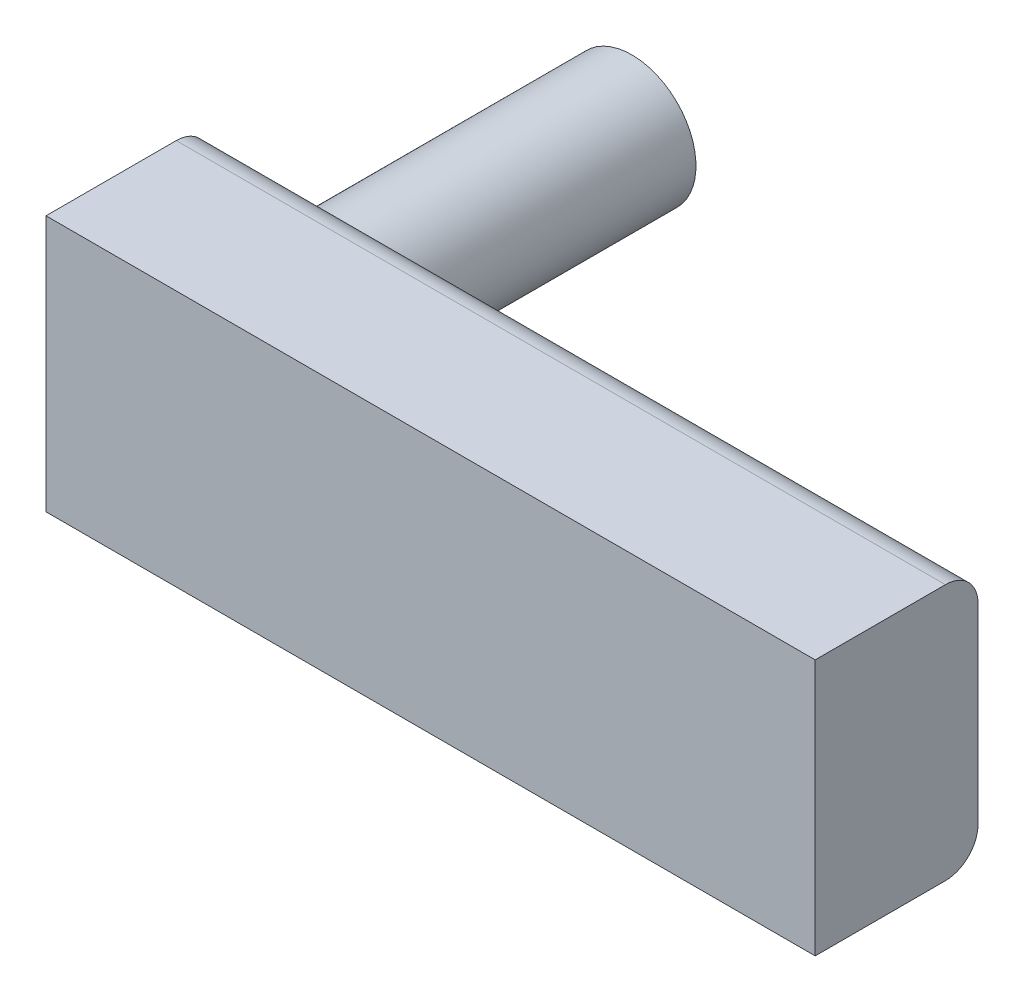
ISO-10303-21;
HEADER;
FILE_DESCRIPTION(('STEP AP214'),'2;1');
FILE_NAME('part.step','',(''),(''),'','','');
FILE_SCHEMA(('AUTOMOTIVE_DESIGN { 1 0 10303 214 1 1 1 1 }'));
ENDSEC;
DATA;
#1=APPLICATION_CONTEXT('core data for automotive mechanical design processes');
#2=APPLICATION_PROTOCOL_DEFINITION('international standard','automotive_design',2000,#1);
#3=PRODUCT_CONTEXT('',#1,'mechanical');
#4=PRODUCT('Part','Part','',(#3));
#5=PRODUCT_RELATED_PRODUCT_CATEGORY('part','',(#4));
#6=PRODUCT_DEFINITION_FORMATION('','',#4);
#7=PRODUCT_DEFINITION_CONTEXT('part definition',#1,'design');
#8=PRODUCT_DEFINITION('design','',#6,#7);
#9=PRODUCT_DEFINITION_SHAPE('','',#8);
#10=(LENGTH_UNIT() NAMED_UNIT(*) SI_UNIT(.MILLI.,.METRE.));
#11=(NAMED_UNIT(*) PLANE_ANGLE_UNIT() SI_UNIT($,.RADIAN.));
#12=(NAMED_UNIT(*) SI_UNIT($,.STERADIAN.) SOLID_ANGLE_UNIT());
#13=UNCERTAINTY_MEASURE_WITH_UNIT(LENGTH_MEASURE(1.E-05),#10,'distance_accuracy_value','');
#14=(GEOMETRIC_REPRESENTATION_CONTEXT(3) GLOBAL_UNCERTAINTY_ASSIGNED_CONTEXT((#13)) GLOBAL_UNIT_ASSIGNED_CONTEXT((#10,
#11,#12)) REPRESENTATION_CONTEXT('',''));
#15=CARTESIAN_POINT('',(0.,0.,0.));
#16=DIRECTION('',(0.,0.,1.));
#17=DIRECTION('',(1.,0.,0.));
#18=AXIS2_PLACEMENT_3D('',#15,#16,#17);
#19=CARTESIAN_POINT('',(-82.4987312572087,-35.4905256220135,12.7));
#20=DIRECTION('',(1.,0.,0.));
#21=DIRECTION('',(0.,0.,-1.));
#22=AXIS2_PLACEMENT_3D('',#19,#20,#21);
#23=PLANE('',#22);
#24=DIRECTION('',(0.,0.,-1.));
#25=VECTOR('',#24,1.);
#26=CARTESIAN_POINT('',(-82.4987312572087,-15.4905256220135,12.7));
#27=LINE('',#26,#25);
#28=CARTESIAN_POINT('',(-82.4987312572087,-15.4905256220135,12.7));
#29=VERTEX_POINT('',#28);
#30=CARTESIAN_POINT('',(-82.4987312572087,-15.4905256220135,2.54));
#31=VERTEX_POINT('',#30);
#32=EDGE_CURVE('E128',#29,#31,#27,.T.);
#33=ORIENTED_EDGE('',*,*,#32,.T.);
#34=CARTESIAN_POINT('',(-82.4987312572087,-18.0305256220135,2.54));
#35=DIRECTION('',(1.,0.,0.));
#36=DIRECTION('',(0.,0.,-1.));
#37=AXIS2_PLACEMENT_3D('',#34,#35,#36);
#38=CIRCLE('',#37,2.54);
#39=CARTESIAN_POINT('',(-82.4987312572087,-18.0305256220135,0.));
#40=VERTEX_POINT('',#39);
#41=EDGE_CURVE('E55',#31,#40,#38,.F.);
#42=ORIENTED_EDGE('',*,*,#41,.T.);
#43=DIRECTION('',(0.,-1.,0.));
#44=VECTOR('',#43,1.);
#45=CARTESIAN_POINT('',(-82.4987312572087,-35.4905256220135,0.));
#46=LINE('',#45,#44);
#47=CARTESIAN_POINT('',(-82.4987312572087,-32.9505256220135,0.));
#48=VERTEX_POINT('',#47);
#49=EDGE_CURVE('E136',#40,#48,#46,.T.);
#50=ORIENTED_EDGE('',*,*,#49,.T.);
#51=CARTESIAN_POINT('',(-82.4987312572087,-32.9505256220135,2.54));
#52=DIRECTION('',(1.,0.,0.));
#53=DIRECTION('',(0.,0.,-1.));
#54=AXIS2_PLACEMENT_3D('',#51,#52,#53);
#55=CIRCLE('',#54,2.54);
#56=CARTESIAN_POINT('',(-82.4987312572087,-35.4905256220135,2.54));
#57=VERTEX_POINT('',#56);
#58=EDGE_CURVE('E107',#48,#57,#55,.F.);
#59=ORIENTED_EDGE('',*,*,#58,.T.);
#60=DIRECTION('',(0.,0.,-1.));
#61=VECTOR('',#60,1.);
#62=CARTESIAN_POINT('',(-82.4987312572087,-35.4905256220135,12.7));
#63=LINE('',#62,#61);
#64=CARTESIAN_POINT('',(-82.4987312572087,-35.4905256220135,12.7));
#65=VERTEX_POINT('',#64);
#66=EDGE_CURVE('E90',#65,#57,#63,.T.);
#67=ORIENTED_EDGE('',*,*,#66,.F.);
#68=DIRECTION('',(0.,-1.,0.));
#69=VECTOR('',#68,1.);
#70=CARTESIAN_POINT('',(-82.4987312572087,-35.4905256220135,12.7));
#71=LINE('',#70,#69);
#72=EDGE_CURVE('E97',#29,#65,#71,.T.);
#73=ORIENTED_EDGE('',*,*,#72,.F.);
#74=EDGE_LOOP('',(#33,#42,#50,#59,#67,#73));
#75=FACE_BOUND('',#74,.T.);
#76=ADVANCED_FACE('F33',(#75),#23,.F.);
#77=CARTESIAN_POINT('',(-22.4987312572088,-35.4905256220135,12.7));
#78=DIRECTION('',(0.,1.,0.));
#79=DIRECTION('',(0.,0.,1.));
#80=AXIS2_PLACEMENT_3D('',#77,#78,#79);
#81=PLANE('',#80);
#82=ORIENTED_EDGE('',*,*,#66,.T.);
#83=DIRECTION('',(1.,0.,0.));
#84=VECTOR('',#83,1.);
#85=CARTESIAN_POINT('',(-22.4987312572088,-35.4905256220135,2.54));
#86=LINE('',#85,#84);
#87=CARTESIAN_POINT('',(-22.4987312572088,-35.4905256220135,2.54));
#88=VERTEX_POINT('',#87);
#89=EDGE_CURVE('E108',#57,#88,#86,.T.);
#90=ORIENTED_EDGE('',*,*,#89,.T.);
#91=DIRECTION('',(0.,0.,-1.));
#92=VECTOR('',#91,1.);
#93=CARTESIAN_POINT('',(-22.4987312572088,-35.4905256220135,12.7));
#94=LINE('',#93,#92);
#95=CARTESIAN_POINT('',(-22.4987312572088,-35.4905256220135,12.7));
#96=VERTEX_POINT('',#95);
#97=EDGE_CURVE('E93',#96,#88,#94,.T.);
#98=ORIENTED_EDGE('',*,*,#97,.F.);
#99=DIRECTION('',(1.,0.,0.));
#100=VECTOR('',#99,1.);
#101=CARTESIAN_POINT('',(-22.4987312572088,-35.4905256220135,12.7));
#102=LINE('',#101,#100);
#103=EDGE_CURVE('E85',#65,#96,#102,.T.);
#104=ORIENTED_EDGE('',*,*,#103,.F.);
#105=EDGE_LOOP('',(#82,#90,#98,#104));
#106=FACE_BOUND('',#105,.T.);
#107=ADVANCED_FACE('F87',(#106),#81,.F.);
#108=CARTESIAN_POINT('',(-22.4987312572088,-15.4905256220135,12.7));
#109=DIRECTION('',(-1.,0.,0.));
#110=DIRECTION('',(0.,0.,1.));
#111=AXIS2_PLACEMENT_3D('',#108,#109,#110);
#112=PLANE('',#111);
#113=DIRECTION('',(0.,1.,0.));
#114=VECTOR('',#113,1.);
#115=CARTESIAN_POINT('',(-22.4987312572088,-15.4905256220135,0.));
#116=LINE('',#115,#114);
#117=CARTESIAN_POINT('',(-22.4987312572088,-32.9505256220135,0.));
#118=VERTEX_POINT('',#117);
#119=CARTESIAN_POINT('',(-22.4987312572088,-18.0305256220135,0.));
#120=VERTEX_POINT('',#119);
#121=EDGE_CURVE('E104',#118,#120,#116,.T.);
#122=ORIENTED_EDGE('',*,*,#121,.T.);
#123=CARTESIAN_POINT('',(-22.4987312572087,-18.0305256220135,2.54));
#124=DIRECTION('',(-1.,0.,0.));
#125=DIRECTION('',(0.,0.,1.));
#126=AXIS2_PLACEMENT_3D('',#123,#124,#125);
#127=CIRCLE('',#126,2.54);
#128=CARTESIAN_POINT('',(-22.4987312572088,-15.4905256220135,2.54));
#129=VERTEX_POINT('',#128);
#130=EDGE_CURVE('E11',#120,#129,#127,.F.);
#131=ORIENTED_EDGE('',*,*,#130,.T.);
#132=DIRECTION('',(0.,0.,-1.));
#133=VECTOR('',#132,1.);
#134=CARTESIAN_POINT('',(-22.4987312572088,-15.4905256220135,12.7));
#135=LINE('',#134,#133);
#136=CARTESIAN_POINT('',(-22.4987312572088,-15.4905256220135,12.7));
#137=VERTEX_POINT('',#136);
#138=EDGE_CURVE('E112',#137,#129,#135,.T.);
#139=ORIENTED_EDGE('',*,*,#138,.F.);
#140=DIRECTION('',(0.,1.,0.));
#141=VECTOR('',#140,1.);
#142=CARTESIAN_POINT('',(-22.4987312572088,-15.4905256220135,12.7));
#143=LINE('',#142,#141);
#144=EDGE_CURVE('E96',#96,#137,#143,.T.);
#145=ORIENTED_EDGE('',*,*,#144,.F.);
#146=ORIENTED_EDGE('',*,*,#97,.T.);
#147=CARTESIAN_POINT('',(-22.4987312572088,-32.9505256220135,2.54));
#148=DIRECTION('',(-1.,0.,0.));
#149=DIRECTION('',(0.,0.,1.));
#150=AXIS2_PLACEMENT_3D('',#147,#148,#149);
#151=CIRCLE('',#150,2.54);
#152=EDGE_CURVE('E110',#88,#118,#151,.F.);
#153=ORIENTED_EDGE('',*,*,#152,.T.);
#154=EDGE_LOOP('',(#122,#131,#139,#145,#146,#153));
#155=FACE_BOUND('',#154,.T.);
#156=ADVANCED_FACE('F160',(#155),#112,.F.);
#157=CARTESIAN_POINT('',(-82.4987312572087,-15.4905256220135,12.7));
#158=DIRECTION('',(0.,-1.,0.));
#159=DIRECTION('',(0.,0.,-1.));
#160=AXIS2_PLACEMENT_3D('',#157,#158,#159);
#161=PLANE('',#160);
#162=ORIENTED_EDGE('',*,*,#138,.T.);
#163=DIRECTION('',(-1.,0.,0.));
#164=VECTOR('',#163,1.);
#165=CARTESIAN_POINT('',(-82.4987312572087,-15.4905256220135,2.54));
#166=LINE('',#165,#164);
#167=EDGE_CURVE('E121',#129,#31,#166,.T.);
#168=ORIENTED_EDGE('',*,*,#167,.T.);
#169=ORIENTED_EDGE('',*,*,#32,.F.);
#170=DIRECTION('',(-1.,0.,0.));
#171=VECTOR('',#170,1.);
#172=CARTESIAN_POINT('',(-82.4987312572087,-15.4905256220135,12.7));
#173=LINE('',#172,#171);
#174=EDGE_CURVE('E102',#137,#29,#173,.T.);
#175=ORIENTED_EDGE('',*,*,#174,.F.);
#176=EDGE_LOOP('',(#162,#168,#169,#175));
#177=FACE_BOUND('',#176,.T.);
#178=ADVANCED_FACE('F127',(#177),#161,.F.);
#179=CARTESIAN_POINT('',(0.,0.,12.7));
#180=DIRECTION('',(0.,0.,-1.));
#181=DIRECTION('',(-1.,0.,0.));
#182=AXIS2_PLACEMENT_3D('',#179,#180,#181);
#183=PLANE('',#182);
#184=ORIENTED_EDGE('',*,*,#72,.T.);
#185=ORIENTED_EDGE('',*,*,#103,.T.);
#186=ORIENTED_EDGE('',*,*,#144,.T.);
#187=ORIENTED_EDGE('',*,*,#174,.T.);
#188=EDGE_LOOP('',(#184,#185,#186,#187));
#189=FACE_BOUND('',#188,.T.);
#190=ADVANCED_FACE('F100',(#189),#183,.F.);
#191=CARTESIAN_POINT('',(0.,0.,0.));
#192=DIRECTION('',(0.,0.,-1.));
#193=DIRECTION('',(-1.,0.,0.));
#194=AXIS2_PLACEMENT_3D('',#191,#192,#193);
#195=PLANE('',#194);
#196=CARTESIAN_POINT('',(-74.8990191403741,-24.8666440278333,0.));
#197=DIRECTION('',(0.,0.,-1.));
#198=DIRECTION('',(-1.,0.,0.));
#199=AXIS2_PLACEMENT_3D('',#196,#197,#198);
#200=CIRCLE('',#199,5.);
#201=CARTESIAN_POINT('',(-79.8990191403742,-24.8666440278333,0.));
#202=VERTEX_POINT('',#201);
#203=EDGE_CURVE('E140',#202,#202,#200,.T.);
#204=ORIENTED_EDGE('',*,*,#203,.F.);
#205=EDGE_LOOP('',(#204));
#206=FACE_BOUND('',#205,.T.);
#207=ORIENTED_EDGE('',*,*,#49,.F.);
#208=DIRECTION('',(-1.,0.,0.));
#209=VECTOR('',#208,1.);
#210=CARTESIAN_POINT('',(-22.4987312572087,-18.0305256220135,0.));
#211=LINE('',#210,#209);
#212=EDGE_CURVE('E41',#40,#120,#211,.F.);
#213=ORIENTED_EDGE('',*,*,#212,.T.);
#214=ORIENTED_EDGE('',*,*,#121,.F.);
#215=DIRECTION('',(1.,0.,0.));
#216=VECTOR('',#215,1.);
#217=CARTESIAN_POINT('',(-82.4987312572087,-32.9505256220135,0.));
#218=LINE('',#217,#216);
#219=EDGE_CURVE('E117',#118,#48,#218,.F.);
#220=ORIENTED_EDGE('',*,*,#219,.T.);
#221=EDGE_LOOP('',(#207,#213,#214,#220));
#222=FACE_BOUND('',#221,.T.);
#223=ADVANCED_FACE('F154',(#206,#222),#195,.T.);
#224=CARTESIAN_POINT('',(-22.4987312572088,-32.9505256220135,2.54));
#225=DIRECTION('',(-1.,0.,0.));
#226=DIRECTION('',(0.,0.,1.));
#227=AXIS2_PLACEMENT_3D('',#224,#225,#226);
#228=CYLINDRICAL_SURFACE('',#227,2.54);
#229=ORIENTED_EDGE('',*,*,#58,.F.);
#230=ORIENTED_EDGE('',*,*,#219,.F.);
#231=ORIENTED_EDGE('',*,*,#152,.F.);
#232=ORIENTED_EDGE('',*,*,#89,.F.);
#233=EDGE_LOOP('',(#229,#230,#231,#232));
#234=FACE_BOUND('',#233,.T.);
#235=ADVANCED_FACE('F156',(#234),#228,.T.);
#236=CARTESIAN_POINT('',(-82.4987312572087,-18.0305256220135,2.54));
#237=DIRECTION('',(1.,0.,0.));
#238=DIRECTION('',(0.,0.,-1.));
#239=AXIS2_PLACEMENT_3D('',#236,#237,#238);
#240=CYLINDRICAL_SURFACE('',#239,2.54);
#241=ORIENTED_EDGE('',*,*,#130,.F.);
#242=ORIENTED_EDGE('',*,*,#212,.F.);
#243=ORIENTED_EDGE('',*,*,#41,.F.);
#244=ORIENTED_EDGE('',*,*,#167,.F.);
#245=EDGE_LOOP('',(#241,#242,#243,#244));
#246=FACE_BOUND('',#245,.T.);
#247=ADVANCED_FACE('F35',(#246),#240,.T.);
#248=CARTESIAN_POINT('',(-74.8990191403741,-24.8666440278333,-25.4));
#249=DIRECTION('',(0.,0.,1.));
#250=DIRECTION('',(1.,0.,0.));
#251=AXIS2_PLACEMENT_3D('',#248,#249,#250);
#252=CYLINDRICAL_SURFACE('',#251,5.);
#253=CARTESIAN_POINT('',(-74.8990191403741,-24.8666440278333,-25.4));
#254=DIRECTION('',(0.,0.,-1.));
#255=DIRECTION('',(-1.,0.,0.));
#256=AXIS2_PLACEMENT_3D('',#253,#254,#255);
#257=CIRCLE('',#256,5.);
#258=CARTESIAN_POINT('',(-79.8990191403742,-24.8666440278333,-25.4));
#259=VERTEX_POINT('',#258);
#260=EDGE_CURVE('E137',#259,#259,#257,.T.);
#261=ORIENTED_EDGE('',*,*,#260,.F.);
#262=EDGE_LOOP('',(#261));
#263=FACE_BOUND('',#262,.T.);
#264=ORIENTED_EDGE('',*,*,#203,.T.);
#265=EDGE_LOOP('',(#264));
#266=FACE_BOUND('',#265,.T.);
#267=ADVANCED_FACE('F148',(#263,#266),#252,.T.);
#268=CARTESIAN_POINT('',(-74.8990191403741,-24.8666440278333,-25.4));
#269=DIRECTION('',(0.,0.,-1.));
#270=DIRECTION('',(-1.,0.,0.));
#271=AXIS2_PLACEMENT_3D('',#268,#269,#270);
#272=PLANE('',#271);
#273=ORIENTED_EDGE('',*,*,#260,.T.);
#274=EDGE_LOOP('',(#273));
#275=FACE_BOUND('',#274,.T.);
#276=ADVANCED_FACE('F146',(#275),#272,.T.);
#277=CLOSED_SHELL('',(#76,#107,#156,#178,#190,#223,#235,#247,#267,#276));
#278=MANIFOLD_SOLID_BREP('B2',#277);
#279=ADVANCED_BREP_SHAPE_REPRESENTATION('',(#18,#278),#14);
#280=SHAPE_DEFINITION_REPRESENTATION(#9,#279);
ENDSEC;
END-ISO-10303-21;
